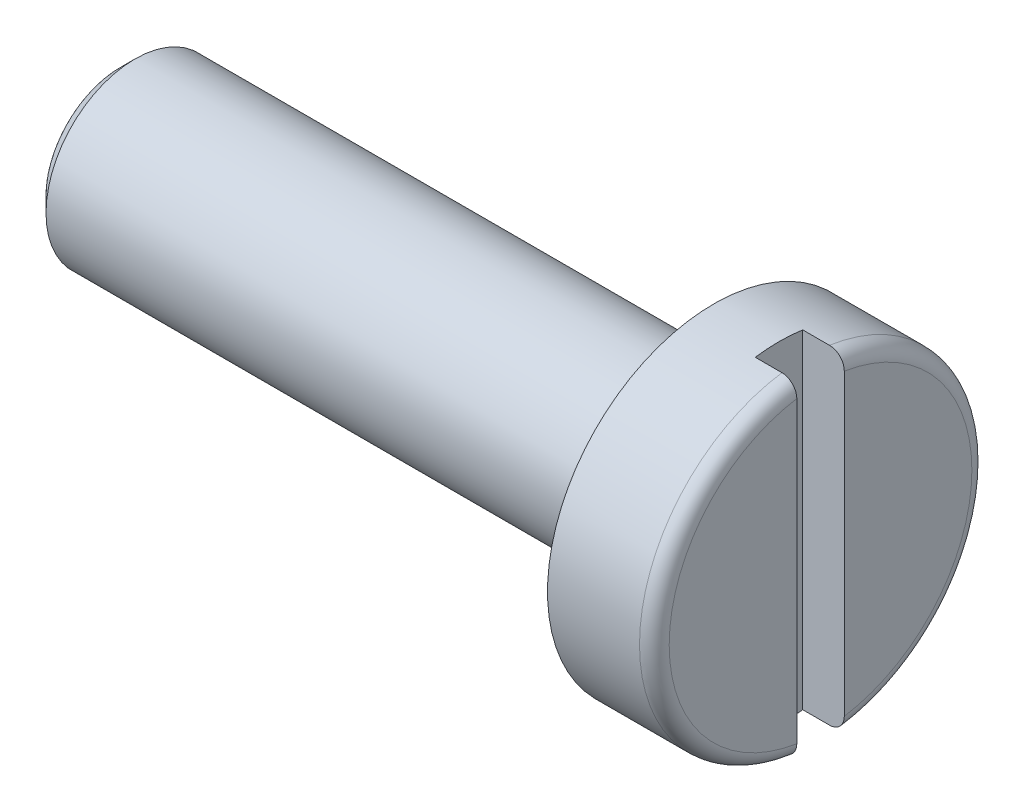
ISO-10303-21;
HEADER;
FILE_DESCRIPTION(('STEP AP214'),'2;1');
FILE_NAME('part.step','',(''),(''),'','','');
FILE_SCHEMA(('AUTOMOTIVE_DESIGN { 1 0 10303 214 1 1 1 1 }'));
ENDSEC;
DATA;
#1=APPLICATION_CONTEXT('core data for automotive mechanical design processes');
#2=APPLICATION_PROTOCOL_DEFINITION('international standard','automotive_design',2000,#1);
#3=PRODUCT_CONTEXT('',#1,'mechanical');
#4=PRODUCT('Part','Part','',(#3));
#5=PRODUCT_RELATED_PRODUCT_CATEGORY('part','',(#4));
#6=PRODUCT_DEFINITION_FORMATION('','',#4);
#7=PRODUCT_DEFINITION_CONTEXT('part definition',#1,'design');
#8=PRODUCT_DEFINITION('design','',#6,#7);
#9=PRODUCT_DEFINITION_SHAPE('','',#8);
#10=(LENGTH_UNIT() NAMED_UNIT(*) SI_UNIT(.MILLI.,.METRE.));
#11=(NAMED_UNIT(*) PLANE_ANGLE_UNIT() SI_UNIT($,.RADIAN.));
#12=(NAMED_UNIT(*) SI_UNIT($,.STERADIAN.) SOLID_ANGLE_UNIT());
#13=UNCERTAINTY_MEASURE_WITH_UNIT(LENGTH_MEASURE(1.E-05),#10,'distance_accuracy_value','');
#14=(GEOMETRIC_REPRESENTATION_CONTEXT(3) GLOBAL_UNCERTAINTY_ASSIGNED_CONTEXT((#13)) GLOBAL_UNIT_ASSIGNED_CONTEXT((#10,
#11,#12)) REPRESENTATION_CONTEXT('',''));
#15=CARTESIAN_POINT('',(0.,0.,0.));
#16=DIRECTION('',(0.,0.,1.));
#17=DIRECTION('',(1.,0.,0.));
#18=AXIS2_PLACEMENT_3D('',#15,#16,#17);
#19=CARTESIAN_POINT('',(0.,0.,0.));
#20=DIRECTION('',(-1.,0.,0.));
#21=DIRECTION('',(0.,0.,1.));
#22=AXIS2_PLACEMENT_3D('',#19,#20,#21);
#23=CYLINDRICAL_SURFACE('',#22,1.25);
#24=CARTESIAN_POINT('',(10.,0.,0.));
#25=DIRECTION('',(-1.,0.,0.));
#26=DIRECTION('',(0.,0.,-1.));
#27=AXIS2_PLACEMENT_3D('',#24,#25,#26);
#28=CIRCLE('',#27,1.25);
#29=CARTESIAN_POINT('',(10.,0.,-1.25));
#30=VERTEX_POINT('',#29);
#31=EDGE_CURVE('P0_E11',#30,#30,#28,.T.);
#32=ORIENTED_EDGE('',*,*,#31,.T.);
#33=CARTESIAN_POINT('',(0.,0.,-1.25));
#34=DIRECTION('',(1.,0.,0.));
#35=VECTOR('',#34,1.);
#36=LINE('',#33,#35);
#37=CARTESIAN_POINT('',(0.,0.,-1.25));
#38=VERTEX_POINT('',#37);
#39=EDGE_CURVE('P0_E27',#38,#30,#36,.T.);
#40=ORIENTED_EDGE('',*,*,#39,.F.);
#41=CARTESIAN_POINT('',(0.,0.,0.));
#42=DIRECTION('',(1.,0.,0.));
#43=DIRECTION('',(0.,0.,-1.));
#44=AXIS2_PLACEMENT_3D('',#41,#42,#43);
#45=CIRCLE('',#44,1.25);
#46=EDGE_CURVE('P0_E46',#38,#38,#45,.T.);
#47=ORIENTED_EDGE('',*,*,#46,.T.);
#48=ORIENTED_EDGE('',*,*,#39,.T.);
#49=EDGE_LOOP('',(#32,#40,#47,#48));
#50=FACE_BOUND('',#49,.T.);
#51=ADVANCED_FACE('P0_F16',(#50),#23,.T.);
#52=CARTESIAN_POINT('',(10.,0.,0.));
#53=DIRECTION('',(-1.,0.,0.));
#54=DIRECTION('',(0.,0.,1.));
#55=AXIS2_PLACEMENT_3D('',#52,#53,#54);
#56=PLANE('',#55);
#57=ORIENTED_EDGE('',*,*,#31,.F.);
#58=EDGE_LOOP('',(#57));
#59=FACE_BOUND('',#58,.T.);
#60=CARTESIAN_POINT('',(10.,1.5,0.));
#61=CARTESIAN_POINT('',(10.,1.49944485432438,-0.298978714802475));
#62=CARTESIAN_POINT('',(10.,1.38581929876717,-0.574025148547617));
#63=CARTESIAN_POINT('',(10.,1.27237987657008,-0.84862102065059));
#64=CARTESIAN_POINT('',(10.,1.06066017177977,-1.06066017177958));
#65=CARTESIAN_POINT('',(10.,0.850620237644176,-1.27101701778694));
#66=CARTESIAN_POINT('',(10.,0.57402514854765,-1.385819298767));
#67=CARTESIAN_POINT('',(10.,0.299442945331056,-1.49978612062476));
#68=CARTESIAN_POINT('',(10.,0.,-1.5));
#69=CARTESIAN_POINT('',(10.,-0.297300186292888,-1.50021234889348));
#70=CARTESIAN_POINT('',(10.,-0.57402514854765,-1.385819298767));
#71=CARTESIAN_POINT('',(10.,-0.848803696688771,-1.27223086071979));
#72=CARTESIAN_POINT('',(10.,-1.06066017177977,-1.06066017177958));
#73=CARTESIAN_POINT('',(10.,-1.27116503976577,-0.850439266678915));
#74=CARTESIAN_POINT('',(10.,-1.38581929876717,-0.574025148547617));
#75=CARTESIAN_POINT('',(10.,-1.49944277959124,-0.300096081066499));
#76=CARTESIAN_POINT('',(10.,-1.5,0.));
#77=B_SPLINE_CURVE_WITH_KNOTS('',2,(#60,#61,#62,#63,#64,#65,#66,#67,#68,#69,#70,#71,#72,#73,#74,
#75,#76),.UNSPECIFIED.,.F.,.F.,(3,2,2,2,2,2,2,2,3),(0.,0.125,0.25,0.375,0.5,0.625,0.75,0.875,
1.),.UNSPECIFIED.);
#78=CARTESIAN_POINT('',(10.,1.5,0.));
#79=VERTEX_POINT('',#78);
#80=CARTESIAN_POINT('',(10.,-1.5,0.));
#81=VERTEX_POINT('',#80);
#82=EDGE_CURVE('P0_E39',#79,#81,#77,.T.);
#83=ORIENTED_EDGE('',*,*,#82,.T.);
#84=CARTESIAN_POINT('',(10.,-1.5,0.));
#85=CARTESIAN_POINT('',(10.,-1.49944485432438,0.298978714802475));
#86=CARTESIAN_POINT('',(10.,-1.38581929876717,0.574025148547617));
#87=CARTESIAN_POINT('',(10.,-1.27237987657008,0.84862102065059));
#88=CARTESIAN_POINT('',(10.,-1.06066017177977,1.06066017177958));
#89=CARTESIAN_POINT('',(10.,-0.850620237644176,1.27101701778694));
#90=CARTESIAN_POINT('',(10.,-0.57402514854765,1.385819298767));
#91=CARTESIAN_POINT('',(10.,-0.299442945331056,1.49978612062476));
#92=CARTESIAN_POINT('',(10.,0.,1.5));
#93=CARTESIAN_POINT('',(10.,0.297300186292888,1.50021234889348));
#94=CARTESIAN_POINT('',(10.,0.57402514854765,1.385819298767));
#95=CARTESIAN_POINT('',(10.,0.848803696688771,1.27223086071979));
#96=CARTESIAN_POINT('',(10.,1.06066017177977,1.06066017177958));
#97=CARTESIAN_POINT('',(10.,1.27116503976577,0.850439266678915));
#98=CARTESIAN_POINT('',(10.,1.38581929876717,0.574025148547617));
#99=CARTESIAN_POINT('',(10.,1.49944277959124,0.300096081066499));
#100=CARTESIAN_POINT('',(10.,1.5,0.));
#101=B_SPLINE_CURVE_WITH_KNOTS('',2,(#84,#85,#86,#87,#88,#89,#90,#91,#92,#93,#94,#95,#96,#97,
#98,#99,#100),.UNSPECIFIED.,.F.,.F.,(3,2,2,2,2,2,2,2,3),(0.,0.125,0.25,0.375,0.5,0.625,0.75,
0.875,1.),.UNSPECIFIED.);
#102=EDGE_CURVE('P0_E43',#81,#79,#101,.T.);
#103=ORIENTED_EDGE('',*,*,#102,.T.);
#104=EDGE_LOOP('',(#83,#103));
#105=FACE_BOUND('',#104,.T.);
#106=ADVANCED_FACE('P0_F17',(#59,#105),#56,.T.);
#107=OPEN_SHELL('',(#51,#106));
#108=SHELL_BASED_SURFACE_MODEL('P0_B1',(#107));
#109=CARTESIAN_POINT('',(11.1,0.,0.));
#110=DIRECTION('',(1.,0.,0.));
#111=DIRECTION('',(0.,1.,0.));
#112=AXIS2_PLACEMENT_3D('',#109,#110,#111);
#113=PLANE('',#112);
#114=DIRECTION('',(0.,1.,0.));
#115=VECTOR('',#114,1.);
#116=CARTESIAN_POINT('',(11.1,-2.77128129211,-0.4));
#117=LINE('',#116,#115);
#118=CARTESIAN_POINT('',(11.1,-2.7712812921101,-0.4));
#119=VERTEX_POINT('',#118);
#120=CARTESIAN_POINT('',(11.1,2.7712812921101,-0.4));
#121=VERTEX_POINT('',#120);
#122=EDGE_CURVE('P1_E11',#119,#121,#117,.T.);
#123=ORIENTED_EDGE('',*,*,#122,.T.);
#124=CARTESIAN_POINT('',(11.1,0.,0.));
#125=DIRECTION('',(1.,0.,0.));
#126=DIRECTION('',(0.,0.,1.));
#127=AXIS2_PLACEMENT_3D('',#124,#125,#126);
#128=CIRCLE('',#127,2.8);
#129=CARTESIAN_POINT('',(11.1,2.7712812921101,0.4));
#130=VERTEX_POINT('',#129);
#131=EDGE_CURVE('P1_E140',#121,#130,#128,.T.);
#132=ORIENTED_EDGE('',*,*,#131,.T.);
#133=DIRECTION('',(0.,-1.,0.));
#134=VECTOR('',#133,1.);
#135=CARTESIAN_POINT('',(11.1,2.77128129211,0.4));
#136=LINE('',#135,#134);
#137=CARTESIAN_POINT('',(11.1,-2.7712812921101,0.4));
#138=VERTEX_POINT('',#137);
#139=EDGE_CURVE('P1_E28',#130,#138,#136,.T.);
#140=ORIENTED_EDGE('',*,*,#139,.T.);
#141=CARTESIAN_POINT('',(11.1,0.,0.));
#142=DIRECTION('',(1.,0.,0.));
#143=DIRECTION('',(0.,0.,1.));
#144=AXIS2_PLACEMENT_3D('',#141,#142,#143);
#145=CIRCLE('',#144,2.8);
#146=EDGE_CURVE('P1_E241',#138,#119,#145,.T.);
#147=ORIENTED_EDGE('',*,*,#146,.T.);
#148=EDGE_LOOP('',(#123,#132,#140,#147));
#149=FACE_BOUND('',#148,.T.);
#150=ADVANCED_FACE('P1_F17',(#149),#113,.T.);
#151=CARTESIAN_POINT('',(11.8,-2.77128129211,-0.4));
#152=DIRECTION('',(0.,0.,-1.));
#153=DIRECTION('',(0.,-1.,0.));
#154=AXIS2_PLACEMENT_3D('',#151,#152,#153);
#155=PLANE('',#154);
#156=DIRECTION('',(1.,0.,0.));
#157=VECTOR('',#156,1.);
#158=CARTESIAN_POINT('',(11.8,2.77128129211,-0.4));
#159=LINE('',#158,#157);
#160=CARTESIAN_POINT('',(11.55,2.7712812921101,-0.4));
#161=VERTEX_POINT('',#160);
#162=EDGE_CURVE('P1_E118',#121,#161,#159,.T.);
#163=ORIENTED_EDGE('',*,*,#162,.F.);
#164=ORIENTED_EDGE('',*,*,#122,.F.);
#165=DIRECTION('',(-1.,0.,0.));
#166=VECTOR('',#165,1.);
#167=CARTESIAN_POINT('',(11.8,-2.77128129211,-0.4));
#168=LINE('',#167,#166);
#169=CARTESIAN_POINT('',(11.55,-2.7712812921101,-0.4));
#170=VERTEX_POINT('',#169);
#171=EDGE_CURVE('P1_E246',#170,#119,#168,.T.);
#172=ORIENTED_EDGE('',*,*,#171,.F.);
#173=CARTESIAN_POINT('',(11.8,-2.5184320518926,-0.399999999999998));
#174=CARTESIAN_POINT('',(11.8000001499877,-2.5232080775273,-0.400000014731042));
#175=CARTESIAN_POINT('',(11.7998665098922,-2.52798410083825,-0.400004206421079));
#176=CARTESIAN_POINT('',(11.799334800731,-2.53747824668973,-0.400019330263479));
#177=CARTESIAN_POINT('',(11.7989391233348,-2.54219650337576,-0.400030201387024));
#178=CARTESIAN_POINT('',(11.7978912282785,-2.55156101291935,-0.400057004385253));
#179=CARTESIAN_POINT('',(11.797241374627,-2.55620753046435,-0.400072889372141));
#180=CARTESIAN_POINT('',(11.7956939110731,-2.56541528445539,-0.400108227012994));
#181=CARTESIAN_POINT('',(11.7947986283706,-2.56997691220869,-0.400127645606346));
#182=CARTESIAN_POINT('',(11.7927696292916,-2.57900245505367,-0.400168711854596));
#183=CARTESIAN_POINT('',(11.791638197094,-2.58346688379076,-0.400190337208213));
#184=CARTESIAN_POINT('',(11.7891467629712,-2.59228645634261,-0.400234635407219));
#185=CARTESIAN_POINT('',(11.7877889957124,-2.59664223153786,-0.400257296576001));
#186=CARTESIAN_POINT('',(11.784855206421,-2.60523379267146,-0.40030263461416));
#187=CARTESIAN_POINT('',(11.7832813636451,-2.60947032282977,-0.400325309319659));
#188=CARTESIAN_POINT('',(11.779926125798,-2.61781356114248,-0.400369787213066));
#189=CARTESIAN_POINT('',(11.7781468490505,-2.62192112120005,-0.400391596642412));
#190=CARTESIAN_POINT('',(11.7743917652759,-2.62999745722752,-0.400433595141505));
#191=CARTESIAN_POINT('',(11.7724180105598,-2.63396718739823,-0.400453797765299));
#192=CARTESIAN_POINT('',(11.7682852485051,-2.64175976701003,-0.40049196589128));
#193=CARTESIAN_POINT('',(11.7661282228171,-2.64558366736636,-0.40050995118434));
#194=CARTESIAN_POINT('',(11.7616403903044,-2.6530773469488,-0.40054319341785));
#195=CARTESIAN_POINT('',(11.7593114902621,-2.6567482680552,-0.400558475331081));
#196=CARTESIAN_POINT('',(11.7544915153807,-2.66392959211244,-0.400585938420153));
#197=CARTESIAN_POINT('',(11.7520022686877,-2.66744122202426,-0.400598148719712));
#198=CARTESIAN_POINT('',(11.74687328555,-2.6742983938252,-0.400619208262128));
#199=CARTESIAN_POINT('',(11.7442352952863,-2.67764524176744,-0.40062808977553));
#200=CARTESIAN_POINT('',(11.7388205355894,-2.68416808766379,-0.400642336669544));
#201=CARTESIAN_POINT('',(11.7360454274795,-2.68734546470068,-0.400647736492828));
#202=CARTESIAN_POINT('',(11.7303681181015,-2.69352539273437,-0.400654963354951));
#203=CARTESIAN_POINT('',(11.727467490837,-2.69652938973654,-0.400656826065548));
#204=CARTESIAN_POINT('',(11.7215507576069,-2.70235934314376,-0.400657013701611));
#205=CARTESIAN_POINT('',(11.7185361362872,-2.70518680635359,-0.400655374618471));
#206=CARTESIAN_POINT('',(11.7124029140323,-2.710661212559,-0.400648678626466));
#207=CARTESIAN_POINT('',(11.7092857067623,-2.71330971704691,-0.400643657154391));
#208=CARTESIAN_POINT('',(11.7029586556877,-2.71842443272481,-0.400630394728944));
#209=CARTESIAN_POINT('',(11.6997501133486,-2.72089225402035,-0.40062218782005));
#210=CARTESIAN_POINT('',(11.6932515417626,-2.72564450678061,-0.400602824820343));
#211=CARTESIAN_POINT('',(11.6899627209548,-2.72793059095216,-0.400591700581557));
#212=CARTESIAN_POINT('',(11.6833145143184,-2.73231891818737,-0.400566838916753));
#213=CARTESIAN_POINT('',(11.6799562434539,-2.734422850633,-0.40055313038849));
#214=CARTESIAN_POINT('',(11.6731797996928,-2.73844703604027,-0.400523495767292));
#215=CARTESIAN_POINT('',(11.6697626482001,-2.74036900924053,-0.400507594894826));
#216=CARTESIAN_POINT('',(11.6628788191908,-2.74403001750719,-0.400474024978898));
#217=CARTESIAN_POINT('',(11.6594130697796,-2.74577079797827,-0.400456376794645));
#218=CARTESIAN_POINT('',(11.6524421088884,-2.749070708094,-0.400419809788738));
#219=CARTESIAN_POINT('',(11.648937732807,-2.75063160276528,-0.400400906820105));
#220=CARTESIAN_POINT('',(11.6418992483377,-2.75357354040086,-0.40036237052659));
#221=CARTESIAN_POINT('',(11.6383658835453,-2.75495636263296,-0.400342747442436));
#222=CARTESIAN_POINT('',(11.6312787979267,-2.75754443198294,-0.40030334879851));
#223=CARTESIAN_POINT('',(11.6277257300895,-2.75875146740747,-0.400283577299506));
#224=CARTESIAN_POINT('',(11.6206082446186,-2.76099068292486,-0.400244492423543));
#225=CARTESIAN_POINT('',(11.6170443908381,-2.76202465535217,-0.400225176397453));
#226=CARTESIAN_POINT('',(11.6099139557561,-2.76392087356048,-0.400187641116465));
#227=CARTESIAN_POINT('',(11.606347850897,-2.76478491089757,-0.400169412010035));
#228=CARTESIAN_POINT('',(11.5992211406517,-2.76634476322792,-0.400134713017984));
#229=CARTESIAN_POINT('',(11.5956609262562,-2.76704236439996,-0.400118225620761));
#230=CARTESIAN_POINT('',(11.5885538194447,-2.76827318907399,-0.400087691744528));
#231=CARTESIAN_POINT('',(11.5850072347441,-2.76880818902139,-0.40007361967634));
#232=CARTESIAN_POINT('',(11.5779347995078,-2.76971797061208,-0.400048615176956));
#233=CARTESIAN_POINT('',(11.5744091757738,-2.77009451475907,-0.400037648677141));
#234=CARTESIAN_POINT('',(11.5673856566793,-2.77069180100568,-0.400019561505633));
#235=CARTESIAN_POINT('',(11.5638879097796,-2.77091428798684,-0.400012397985044));
#236=CARTESIAN_POINT('',(11.5569267295714,-2.77120819658656,-0.400002648943097));
#237=CARTESIAN_POINT('',(11.5534633689794,-2.77128134092906,-0.400000011271691));
#238=CARTESIAN_POINT('',(11.55,-2.7712812921102,-0.399999999999997));
#239=B_SPLINE_CURVE_WITH_KNOTS('',3,(#173,#174,#175,#176,#177,#178,#179,#180,#181,#182,#183,
#184,#185,#186,#187,#188,#189,#190,#191,#192,#193,#194,#195,#196,#197,#198,#199,#200,#201,#202,
#203,#204,#205,#206,#207,#208,#209,#210,#211,#212,#213,#214,#215,#216,#217,#218,#219,#220,#221,
#222,#223,#224,#225,#226,#227,#228,#229,#230,#231,#232,#233,#234,#235,#236,#237,#238),
.UNSPECIFIED.,.F.,.F.,(4,2,2,2,2,2,2,2,2,2,2,2,2,2,2,2,2,2,2,2,2,2,2,2,2,2,2,2,2,2,2,2,4),(0.,
0.0143261945096147,0.0285234004453319,0.0425915880474614,0.0565307362643893,0.0703408344989951,
0.0840218842562883,0.097573900686072,0.110996914015537,0.124290970867783,0.137456135463422,
0.150492490703561,0.163400139133604,0.17617920378845,0.188829828920755,0.201352180614966,
0.213746447290823,0.226012840100953,0.238151593228016,0.250162964087615,0.262047233443892,
0.273804705445259,0.285435707588242,0.296940590617828,0.308319728372957,0.319573517586092,
0.330702377645872,0.341706750331957,0.352587099531127,0.36334391094361,0.37397769178848,
0.384488970516739,0.394878296540456),.UNSPECIFIED.);
#240=CARTESIAN_POINT('',(11.8,-2.518432051893,-0.4));
#241=VERTEX_POINT('',#240);
#242=EDGE_CURVE('P1_E93',#241,#170,#239,.T.);
#243=ORIENTED_EDGE('',*,*,#242,.F.);
#244=DIRECTION('',(0.,1.,0.));
#245=VECTOR('',#244,1.);
#246=CARTESIAN_POINT('',(11.8,0.,-0.4));
#247=LINE('',#246,#245);
#248=CARTESIAN_POINT('',(11.8,2.518432051893,-0.4));
#249=VERTEX_POINT('',#248);
#250=EDGE_CURVE('P1_E41',#241,#249,#247,.T.);
#251=ORIENTED_EDGE('',*,*,#250,.T.);
#252=CARTESIAN_POINT('',(11.55,2.7712812921102,-0.400000000000007));
#253=CARTESIAN_POINT('',(11.5534633689794,2.77128134092906,-0.400000011271698));
#254=CARTESIAN_POINT('',(11.5569267295714,2.77120819658656,-0.400002648943104));
#255=CARTESIAN_POINT('',(11.5638879097796,2.77091428798684,-0.400012397985052));
#256=CARTESIAN_POINT('',(11.5673856566793,2.77069180100567,-0.400019561505642));
#257=CARTESIAN_POINT('',(11.5744091757738,2.77009451475907,-0.40003764867715));
#258=CARTESIAN_POINT('',(11.5779347995078,2.76971797061207,-0.400048615176964));
#259=CARTESIAN_POINT('',(11.5850072347441,2.76880818902139,-0.400073619676348));
#260=CARTESIAN_POINT('',(11.5885538194447,2.76827318907399,-0.400087691744539));
#261=CARTESIAN_POINT('',(11.5956609262562,2.76704236439996,-0.400118225620772));
#262=CARTESIAN_POINT('',(11.5992211406517,2.76634476322792,-0.400134713017994));
#263=CARTESIAN_POINT('',(11.606347850897,2.76478491089757,-0.400169412010044));
#264=CARTESIAN_POINT('',(11.6099139557561,2.76392087356048,-0.400187641116474));
#265=CARTESIAN_POINT('',(11.6170443908381,2.76202465535216,-0.400225176397463));
#266=CARTESIAN_POINT('',(11.6206082446186,2.76099068292485,-0.400244492423551));
#267=CARTESIAN_POINT('',(11.6277257300895,2.75875146740747,-0.400283577299515));
#268=CARTESIAN_POINT('',(11.6312787979267,2.75754443198294,-0.400303348798519));
#269=CARTESIAN_POINT('',(11.6383658835453,2.75495636263295,-0.400342747442445));
#270=CARTESIAN_POINT('',(11.6418992483377,2.75357354040086,-0.400362370526598));
#271=CARTESIAN_POINT('',(11.648937732807,2.75063160276528,-0.400400906820111));
#272=CARTESIAN_POINT('',(11.6524421088884,2.74907070809399,-0.400419809788744));
#273=CARTESIAN_POINT('',(11.6594130697796,2.74577079797827,-0.400456376794652));
#274=CARTESIAN_POINT('',(11.6628788191908,2.74403001750718,-0.400474024978906));
#275=CARTESIAN_POINT('',(11.6697626482001,2.74036900924052,-0.400507594894833));
#276=CARTESIAN_POINT('',(11.6731797996928,2.73844703604027,-0.400523495767297));
#277=CARTESIAN_POINT('',(11.6799562434539,2.734422850633,-0.400553130388495));
#278=CARTESIAN_POINT('',(11.6833145143184,2.73231891818737,-0.40056683891676));
#279=CARTESIAN_POINT('',(11.6899627209548,2.72793059095216,-0.400591700581565));
#280=CARTESIAN_POINT('',(11.6932515417626,2.7256445067806,-0.400602824820349));
#281=CARTESIAN_POINT('',(11.6997501133486,2.72089225402035,-0.400622187820055));
#282=CARTESIAN_POINT('',(11.7029586556877,2.7184244327248,-0.400630394728949));
#283=CARTESIAN_POINT('',(11.7092857067623,2.71330971704691,-0.400643657154397));
#284=CARTESIAN_POINT('',(11.7124029140324,2.710661212559,-0.400648678626472));
#285=CARTESIAN_POINT('',(11.7185361362872,2.70518680635359,-0.400655374618477));
#286=CARTESIAN_POINT('',(11.7215507576069,2.70235934314376,-0.400657013701617));
#287=CARTESIAN_POINT('',(11.727467490837,2.69652938973653,-0.400656826065554));
#288=CARTESIAN_POINT('',(11.7303681181015,2.69352539273436,-0.400654963354956));
#289=CARTESIAN_POINT('',(11.7360454274795,2.68734546470067,-0.400647736492833));
#290=CARTESIAN_POINT('',(11.7388205355894,2.68416808766378,-0.400642336669549));
#291=CARTESIAN_POINT('',(11.7442352952863,2.67764524176744,-0.400628089775533));
#292=CARTESIAN_POINT('',(11.74687328555,2.67429839382519,-0.400619208262131));
#293=CARTESIAN_POINT('',(11.7520022686877,2.66744122202426,-0.400598148719713));
#294=CARTESIAN_POINT('',(11.7544915153807,2.66392959211244,-0.400585938420154));
#295=CARTESIAN_POINT('',(11.7593114902621,2.65674826805519,-0.400558475331082));
#296=CARTESIAN_POINT('',(11.7616403903044,2.6530773469488,-0.400543193417851));
#297=CARTESIAN_POINT('',(11.7661282228171,2.64558366736636,-0.40050995118434));
#298=CARTESIAN_POINT('',(11.7682852485051,2.64175976701002,-0.40049196589128));
#299=CARTESIAN_POINT('',(11.7724180105598,2.63396718739823,-0.400453797765298));
#300=CARTESIAN_POINT('',(11.7743917652759,2.62999745722751,-0.400433595141503));
#301=CARTESIAN_POINT('',(11.7781468490505,2.62192112120004,-0.400391596642411));
#302=CARTESIAN_POINT('',(11.779926125798,2.61781356114247,-0.400369787213067));
#303=CARTESIAN_POINT('',(11.7832813636451,2.60947032282977,-0.400325309319659));
#304=CARTESIAN_POINT('',(11.784855206421,2.60523379267146,-0.400302634614159));
#305=CARTESIAN_POINT('',(11.7877889957124,2.59664223153786,-0.400257296575998));
#306=CARTESIAN_POINT('',(11.7891467629712,2.59228645634261,-0.400234635407217));
#307=CARTESIAN_POINT('',(11.791638197094,2.58346688379076,-0.400190337208209));
#308=CARTESIAN_POINT('',(11.7927696292916,2.57900245505367,-0.400168711854589));
#309=CARTESIAN_POINT('',(11.7947986283706,2.56997691220869,-0.40012764560634));
#310=CARTESIAN_POINT('',(11.7956939110731,2.56541528445539,-0.400108227012991));
#311=CARTESIAN_POINT('',(11.797241374627,2.55620753046435,-0.400072889372138));
#312=CARTESIAN_POINT('',(11.7978912282785,2.55156101291935,-0.400057004385247));
#313=CARTESIAN_POINT('',(11.7989391233348,2.54219650337576,-0.400030201387018));
#314=CARTESIAN_POINT('',(11.799334800731,2.53747824668973,-0.400019330263475));
#315=CARTESIAN_POINT('',(11.7998665098922,2.52798410083825,-0.400004206421077));
#316=CARTESIAN_POINT('',(11.8000001499877,2.5232080775273,-0.400000014731041));
#317=CARTESIAN_POINT('',(11.8,2.5184320518926,-0.399999999999992));
#318=B_SPLINE_CURVE_WITH_KNOTS('',3,(#252,#253,#254,#255,#256,#257,#258,#259,#260,#261,#262,
#263,#264,#265,#266,#267,#268,#269,#270,#271,#272,#273,#274,#275,#276,#277,#278,#279,#280,#281,
#282,#283,#284,#285,#286,#287,#288,#289,#290,#291,#292,#293,#294,#295,#296,#297,#298,#299,#300,
#301,#302,#303,#304,#305,#306,#307,#308,#309,#310,#311,#312,#313,#314,#315,#316,#317),
.UNSPECIFIED.,.F.,.F.,(4,2,2,2,2,2,2,2,2,2,2,2,2,2,2,2,2,2,2,2,2,2,2,2,2,2,2,2,2,2,2,2,4),(0.,
0.0103893260237183,0.0209006047519773,0.031534385596847,0.0422911970093303,0.0531715462085023,
0.0641759188945876,0.0753047789543691,0.0865585681675039,0.0979377059226329,0.109442588952219,
0.121073591095202,0.132831063096569,0.144715332452847,0.156726703312446,0.168865456439507,
0.181131849249637,0.193526115925495,0.206048467619706,0.218699092752012,0.231478157406856,
0.244385805836899,0.257422161077037,0.270587325672677,0.283881382524922,0.297304395854386,
0.31085641228417,0.324537462041462,0.338347560276067,0.352286708492994,0.366354896095123,
0.380552102030839,0.394878296540453),.UNSPECIFIED.);
#319=EDGE_CURVE('P1_E113',#161,#249,#318,.T.);
#320=ORIENTED_EDGE('',*,*,#319,.F.);
#321=EDGE_LOOP('',(#163,#164,#172,#243,#251,#320));
#322=FACE_BOUND('',#321,.T.);
#323=ADVANCED_FACE('P1_F116',(#322),#155,.F.);
#324=CARTESIAN_POINT('',(11.8,2.77128129211,0.4));
#325=DIRECTION('',(0.,0.,1.));
#326=DIRECTION('',(1.,0.,0.));
#327=AXIS2_PLACEMENT_3D('',#324,#325,#326);
#328=PLANE('',#327);
#329=DIRECTION('',(1.,0.,0.));
#330=VECTOR('',#329,1.);
#331=CARTESIAN_POINT('',(11.8,-2.77128129211,0.4));
#332=LINE('',#331,#330);
#333=CARTESIAN_POINT('',(11.55,-2.7712812921101,0.4));
#334=VERTEX_POINT('',#333);
#335=EDGE_CURVE('P1_E198',#138,#334,#332,.T.);
#336=ORIENTED_EDGE('',*,*,#335,.F.);
#337=ORIENTED_EDGE('',*,*,#139,.F.);
#338=DIRECTION('',(-1.,0.,0.));
#339=VECTOR('',#338,1.);
#340=CARTESIAN_POINT('',(11.8,2.77128129211,0.4));
#341=LINE('',#340,#339);
#342=CARTESIAN_POINT('',(11.55,2.7712812921101,0.4));
#343=VERTEX_POINT('',#342);
#344=EDGE_CURVE('P1_E147',#343,#130,#341,.T.);
#345=ORIENTED_EDGE('',*,*,#344,.F.);
#346=CARTESIAN_POINT('',(11.8,2.5184320518926,0.399999999999999));
#347=CARTESIAN_POINT('',(11.8000001499877,2.5232080775273,0.400000014731043));
#348=CARTESIAN_POINT('',(11.7998665098922,2.52798410083825,0.400004206421079));
#349=CARTESIAN_POINT('',(11.799334800731,2.53747824668973,0.40001933026348));
#350=CARTESIAN_POINT('',(11.7989391233348,2.54219650337576,0.400030201387025));
#351=CARTESIAN_POINT('',(11.7978912282785,2.55156101291935,0.400057004385254));
#352=CARTESIAN_POINT('',(11.797241374627,2.55620753046435,0.400072889372141));
#353=CARTESIAN_POINT('',(11.7956939110731,2.56541528445539,0.400108227012994));
#354=CARTESIAN_POINT('',(11.7947986283706,2.56997691220869,0.400127645606346));
#355=CARTESIAN_POINT('',(11.7927696292916,2.57900245505367,0.400168711854596));
#356=CARTESIAN_POINT('',(11.791638197094,2.58346688379076,0.400190337208213));
#357=CARTESIAN_POINT('',(11.7891467629712,2.59228645634261,0.400234635407219));
#358=CARTESIAN_POINT('',(11.7877889957124,2.59664223153786,0.400257296576001));
#359=CARTESIAN_POINT('',(11.784855206421,2.60523379267146,0.400302634614161));
#360=CARTESIAN_POINT('',(11.7832813636451,2.60947032282977,0.400325309319659));
#361=CARTESIAN_POINT('',(11.779926125798,2.61781356114248,0.400369787213066));
#362=CARTESIAN_POINT('',(11.7781468490505,2.62192112120005,0.400391596642412));
#363=CARTESIAN_POINT('',(11.7743917652759,2.62999745722751,0.400433595141505));
#364=CARTESIAN_POINT('',(11.7724180105598,2.63396718739823,0.400453797765299));
#365=CARTESIAN_POINT('',(11.7682852485051,2.64175976701003,0.40049196589128));
#366=CARTESIAN_POINT('',(11.766128222817,2.64558366736636,0.40050995118434));
#367=CARTESIAN_POINT('',(11.7616403903044,2.6530773469488,0.40054319341785));
#368=CARTESIAN_POINT('',(11.759311490262,2.65674826805519,0.400558475331081));
#369=CARTESIAN_POINT('',(11.7544915153807,2.66392959211244,0.400585938420153));
#370=CARTESIAN_POINT('',(11.7520022686877,2.66744122202426,0.400598148719712));
#371=CARTESIAN_POINT('',(11.74687328555,2.67429839382519,0.400619208262129));
#372=CARTESIAN_POINT('',(11.7442352952863,2.67764524176744,0.40062808977553));
#373=CARTESIAN_POINT('',(11.7388205355894,2.68416808766378,0.400642336669544));
#374=CARTESIAN_POINT('',(11.7360454274795,2.68734546470067,0.400647736492828));
#375=CARTESIAN_POINT('',(11.7303681181015,2.69352539273436,0.400654963354951));
#376=CARTESIAN_POINT('',(11.727467490837,2.69652938973653,0.400656826065548));
#377=CARTESIAN_POINT('',(11.7215507576069,2.70235934314376,0.400657013701611));
#378=CARTESIAN_POINT('',(11.7185361362872,2.70518680635359,0.400655374618471));
#379=CARTESIAN_POINT('',(11.7124029140323,2.710661212559,0.400648678626466));
#380=CARTESIAN_POINT('',(11.7092857067623,2.71330971704691,0.400643657154391));
#381=CARTESIAN_POINT('',(11.7029586556877,2.71842443272481,0.400630394728943));
#382=CARTESIAN_POINT('',(11.6997501133486,2.72089225402035,0.40062218782005));
#383=CARTESIAN_POINT('',(11.6932515417626,2.72564450678061,0.400602824820342));
#384=CARTESIAN_POINT('',(11.6899627209548,2.72793059095216,0.400591700581557));
#385=CARTESIAN_POINT('',(11.6833145143184,2.73231891818737,0.400566838916753));
#386=CARTESIAN_POINT('',(11.6799562434539,2.734422850633,0.40055313038849));
#387=CARTESIAN_POINT('',(11.6731797996928,2.73844703604027,0.400523495767292));
#388=CARTESIAN_POINT('',(11.6697626482001,2.74036900924053,0.400507594894826));
#389=CARTESIAN_POINT('',(11.6628788191908,2.74403001750718,0.400474024978898));
#390=CARTESIAN_POINT('',(11.6594130697796,2.74577079797827,0.400456376794645));
#391=CARTESIAN_POINT('',(11.6524421088884,2.74907070809399,0.400419809788737));
#392=CARTESIAN_POINT('',(11.648937732807,2.75063160276528,0.400400906820104));
#393=CARTESIAN_POINT('',(11.6418992483377,2.75357354040086,0.40036237052659));
#394=CARTESIAN_POINT('',(11.6383658835453,2.75495636263296,0.400342747442436));
#395=CARTESIAN_POINT('',(11.6312787979267,2.75754443198294,0.400303348798509));
#396=CARTESIAN_POINT('',(11.6277257300895,2.75875146740747,0.400283577299506));
#397=CARTESIAN_POINT('',(11.6206082446186,2.76099068292486,0.400244492423542));
#398=CARTESIAN_POINT('',(11.6170443908381,2.76202465535217,0.400225176397453));
#399=CARTESIAN_POINT('',(11.6099139557561,2.76392087356048,0.400187641116465));
#400=CARTESIAN_POINT('',(11.606347850897,2.76478491089757,0.400169412010035));
#401=CARTESIAN_POINT('',(11.5992211406517,2.76634476322792,0.400134713017984));
#402=CARTESIAN_POINT('',(11.5956609262562,2.76704236439996,0.400118225620761));
#403=CARTESIAN_POINT('',(11.5885538194447,2.76827318907399,0.400087691744527));
#404=CARTESIAN_POINT('',(11.5850072347441,2.76880818902139,0.40007361967634));
#405=CARTESIAN_POINT('',(11.5779347995078,2.76971797061208,0.400048615176956));
#406=CARTESIAN_POINT('',(11.5744091757738,2.77009451475907,0.400037648677141));
#407=CARTESIAN_POINT('',(11.5673856566793,2.77069180100567,0.400019561505632));
#408=CARTESIAN_POINT('',(11.5638879097796,2.77091428798684,0.400012397985044));
#409=CARTESIAN_POINT('',(11.5569267295714,2.77120819658656,0.400002648943096));
#410=CARTESIAN_POINT('',(11.5534633689794,2.77128134092906,0.400000011271691));
#411=CARTESIAN_POINT('',(11.55,2.7712812921102,0.399999999999997));
#412=B_SPLINE_CURVE_WITH_KNOTS('',3,(#346,#347,#348,#349,#350,#351,#352,#353,#354,#355,#356,
#357,#358,#359,#360,#361,#362,#363,#364,#365,#366,#367,#368,#369,#370,#371,#372,#373,#374,#375,
#376,#377,#378,#379,#380,#381,#382,#383,#384,#385,#386,#387,#388,#389,#390,#391,#392,#393,#394,
#395,#396,#397,#398,#399,#400,#401,#402,#403,#404,#405,#406,#407,#408,#409,#410,#411),
.UNSPECIFIED.,.F.,.F.,(4,2,2,2,2,2,2,2,2,2,2,2,2,2,2,2,2,2,2,2,2,2,2,2,2,2,2,2,2,2,2,2,4),(0.,
0.0143261945096143,0.028523400445331,0.0425915880474601,0.0565307362643881,0.0703408344989934,
0.0840218842562856,0.0975739006860696,0.110996914015534,0.12429097086778,0.137456135463419,
0.150492490703558,0.163400139133601,0.176179203788446,0.188829828920751,0.201352180614962,
0.21374644729082,0.22601284010095,0.238151593228011,0.25016296408761,0.262047233443887,
0.273804705445254,0.285435707588237,0.296940590617823,0.308319728372952,0.319573517586087,
0.330702377645865,0.341706750331952,0.352587099531123,0.363343910943606,0.373977691788476,
0.384488970516733,0.394878296540451),.UNSPECIFIED.);
#413=CARTESIAN_POINT('',(11.8,2.518432051893,0.4));
#414=VERTEX_POINT('',#413);
#415=EDGE_CURVE('P1_E123',#414,#343,#412,.T.);
#416=ORIENTED_EDGE('',*,*,#415,.F.);
#417=DIRECTION('',(0.,-1.,0.));
#418=VECTOR('',#417,1.);
#419=CARTESIAN_POINT('',(11.8,0.,0.4));
#420=LINE('',#419,#418);
#421=CARTESIAN_POINT('',(11.8,-2.518432051893,0.4));
#422=VERTEX_POINT('',#421);
#423=EDGE_CURVE('P1_E214',#414,#422,#420,.T.);
#424=ORIENTED_EDGE('',*,*,#423,.T.);
#425=CARTESIAN_POINT('',(11.55,-2.7712812921102,0.400000000000007));
#426=CARTESIAN_POINT('',(11.5534633689794,-2.77128134092906,0.400000011271699));
#427=CARTESIAN_POINT('',(11.5569267295714,-2.77120819658656,0.400002648943104));
#428=CARTESIAN_POINT('',(11.5638879097796,-2.77091428798684,0.400012397985053));
#429=CARTESIAN_POINT('',(11.5673856566793,-2.77069180100567,0.400019561505643));
#430=CARTESIAN_POINT('',(11.5744091757738,-2.77009451475907,0.40003764867715));
#431=CARTESIAN_POINT('',(11.5779347995078,-2.76971797061207,0.400048615176964));
#432=CARTESIAN_POINT('',(11.5850072347441,-2.76880818902139,0.400073619676349));
#433=CARTESIAN_POINT('',(11.5885538194447,-2.76827318907399,0.400087691744539));
#434=CARTESIAN_POINT('',(11.5956609262562,-2.76704236439996,0.400118225620773));
#435=CARTESIAN_POINT('',(11.5992211406517,-2.76634476322791,0.400134713017994));
#436=CARTESIAN_POINT('',(11.606347850897,-2.76478491089757,0.400169412010044));
#437=CARTESIAN_POINT('',(11.6099139557561,-2.76392087356048,0.400187641116475));
#438=CARTESIAN_POINT('',(11.6170443908381,-2.76202465535216,0.400225176397463));
#439=CARTESIAN_POINT('',(11.6206082446186,-2.76099068292485,0.400244492423552));
#440=CARTESIAN_POINT('',(11.6277257300895,-2.75875146740746,0.400283577299515));
#441=CARTESIAN_POINT('',(11.6312787979267,-2.75754443198294,0.400303348798519));
#442=CARTESIAN_POINT('',(11.6383658835453,-2.75495636263295,0.400342747442446));
#443=CARTESIAN_POINT('',(11.6418992483377,-2.75357354040086,0.400362370526599));
#444=CARTESIAN_POINT('',(11.648937732807,-2.75063160276528,0.400400906820112));
#445=CARTESIAN_POINT('',(11.6524421088884,-2.74907070809399,0.400419809788745));
#446=CARTESIAN_POINT('',(11.6594130697796,-2.74577079797827,0.400456376794653));
#447=CARTESIAN_POINT('',(11.6628788191908,-2.74403001750718,0.400474024978907));
#448=CARTESIAN_POINT('',(11.6697626482001,-2.74036900924052,0.400507594894834));
#449=CARTESIAN_POINT('',(11.6731797996928,-2.73844703604027,0.400523495767298));
#450=CARTESIAN_POINT('',(11.6799562434539,-2.734422850633,0.400553130388496));
#451=CARTESIAN_POINT('',(11.6833145143184,-2.73231891818737,0.400566838916761));
#452=CARTESIAN_POINT('',(11.6899627209548,-2.72793059095216,0.400591700581566));
#453=CARTESIAN_POINT('',(11.6932515417626,-2.7256445067806,0.40060282482035));
#454=CARTESIAN_POINT('',(11.6997501133486,-2.72089225402035,0.400622187820056));
#455=CARTESIAN_POINT('',(11.7029586556877,-2.7184244327248,0.40063039472895));
#456=CARTESIAN_POINT('',(11.7092857067623,-2.71330971704691,0.400643657154398));
#457=CARTESIAN_POINT('',(11.7124029140323,-2.710661212559,0.400648678626473));
#458=CARTESIAN_POINT('',(11.7185361362872,-2.70518680635359,0.400655374618478));
#459=CARTESIAN_POINT('',(11.7215507576069,-2.70235934314376,0.400657013701618));
#460=CARTESIAN_POINT('',(11.727467490837,-2.69652938973653,0.400656826065555));
#461=CARTESIAN_POINT('',(11.7303681181015,-2.69352539273436,0.400654963354957));
#462=CARTESIAN_POINT('',(11.7360454274795,-2.68734546470067,0.400647736492834));
#463=CARTESIAN_POINT('',(11.7388205355894,-2.68416808766378,0.40064233666955));
#464=CARTESIAN_POINT('',(11.7442352952863,-2.67764524176744,0.400628089775535));
#465=CARTESIAN_POINT('',(11.74687328555,-2.67429839382519,0.400619208262132));
#466=CARTESIAN_POINT('',(11.7520022686877,-2.66744122202426,0.400598148719714));
#467=CARTESIAN_POINT('',(11.7544915153807,-2.66392959211244,0.400585938420155));
#468=CARTESIAN_POINT('',(11.7593114902621,-2.65674826805519,0.400558475331083));
#469=CARTESIAN_POINT('',(11.7616403903044,-2.6530773469488,0.400543193417852));
#470=CARTESIAN_POINT('',(11.766128222817,-2.64558366736636,0.400509951184342));
#471=CARTESIAN_POINT('',(11.7682852485051,-2.64175976701002,0.400491965891282));
#472=CARTESIAN_POINT('',(11.7724180105598,-2.63396718739823,0.4004537977653));
#473=CARTESIAN_POINT('',(11.7743917652759,-2.62999745722751,0.400433595141504));
#474=CARTESIAN_POINT('',(11.7781468490505,-2.62192112120004,0.400391596642412));
#475=CARTESIAN_POINT('',(11.779926125798,-2.61781356114247,0.400369787213068));
#476=CARTESIAN_POINT('',(11.7832813636451,-2.60947032282977,0.400325309319661));
#477=CARTESIAN_POINT('',(11.784855206421,-2.60523379267146,0.40030263461416));
#478=CARTESIAN_POINT('',(11.7877889957124,-2.59664223153786,0.400257296575999));
#479=CARTESIAN_POINT('',(11.7891467629712,-2.59228645634261,0.400234635407218));
#480=CARTESIAN_POINT('',(11.791638197094,-2.58346688379076,0.40019033720821));
#481=CARTESIAN_POINT('',(11.7927696292916,-2.57900245505367,0.400168711854591));
#482=CARTESIAN_POINT('',(11.7947986283706,-2.56997691220869,0.400127645606342));
#483=CARTESIAN_POINT('',(11.7956939110731,-2.56541528445539,0.400108227012993));
#484=CARTESIAN_POINT('',(11.797241374627,-2.55620753046435,0.400072889372139));
#485=CARTESIAN_POINT('',(11.7978912282785,-2.55156101291935,0.400057004385248));
#486=CARTESIAN_POINT('',(11.7989391233348,-2.54219650337576,0.400030201387019));
#487=CARTESIAN_POINT('',(11.799334800731,-2.53747824668974,0.400019330263477));
#488=CARTESIAN_POINT('',(11.7998665098922,-2.52798410083825,0.400004206421079));
#489=CARTESIAN_POINT('',(11.8000001499877,-2.5232080775273,0.400000014731043));
#490=CARTESIAN_POINT('',(11.8,-2.5184320518926,0.399999999999994));
#491=B_SPLINE_CURVE_WITH_KNOTS('',3,(#425,#426,#427,#428,#429,#430,#431,#432,#433,#434,#435,
#436,#437,#438,#439,#440,#441,#442,#443,#444,#445,#446,#447,#448,#449,#450,#451,#452,#453,#454,
#455,#456,#457,#458,#459,#460,#461,#462,#463,#464,#465,#466,#467,#468,#469,#470,#471,#472,#473,
#474,#475,#476,#477,#478,#479,#480,#481,#482,#483,#484,#485,#486,#487,#488,#489,#490),
.UNSPECIFIED.,.F.,.F.,(4,2,2,2,2,2,2,2,2,2,2,2,2,2,2,2,2,2,2,2,2,2,2,2,2,2,2,2,2,2,2,2,4),(0.,
0.0103893260237183,0.0209006047519773,0.0315343855968471,0.0422911970093303,0.0531715462085007,
0.0641759188945875,0.0753047789543673,0.0865585681675021,0.0979377059226311,0.109442588952217,
0.121073591095202,0.132831063096568,0.144715332452845,0.156726703312444,0.168865456439505,
0.181131849249635,0.193526115925492,0.206048467619704,0.218699092752008,0.231478157406854,
0.244385805836897,0.257422161077035,0.270587325672674,0.283881382524919,0.297304395854384,
0.310856412284167,0.324537462041459,0.338347560276063,0.352286708492991,0.36635489609512,
0.380552102030836,0.39487829654045),.UNSPECIFIED.);
#492=EDGE_CURVE('P1_E134',#334,#422,#491,.T.);
#493=ORIENTED_EDGE('',*,*,#492,.F.);
#494=EDGE_LOOP('',(#336,#337,#345,#416,#424,#493));
#495=FACE_BOUND('',#494,.T.);
#496=ADVANCED_FACE('P1_F199',(#495),#328,.F.);
#497=CARTESIAN_POINT('',(11.8,0.,0.));
#498=DIRECTION('',(-1.,0.,0.));
#499=DIRECTION('',(0.,0.,1.));
#500=AXIS2_PLACEMENT_3D('',#497,#498,#499);
#501=PLANE('',#500);
#502=ORIENTED_EDGE('',*,*,#250,.F.);
#503=CARTESIAN_POINT('',(11.8,0.,0.));
#504=DIRECTION('',(-1.,0.,0.));
#505=DIRECTION('',(0.,-0.987620412506908,-0.156862745098015));
#506=AXIS2_PLACEMENT_3D('',#503,#504,#505);
#507=CIRCLE('',#506,2.55000000000039);
#508=EDGE_CURVE('P1_E122',#249,#241,#507,.T.);
#509=ORIENTED_EDGE('',*,*,#508,.F.);
#510=EDGE_LOOP('',(#502,#509));
#511=FACE_BOUND('',#510,.T.);
#512=ADVANCED_FACE('P1_F208',(#511),#501,.F.);
#513=CARTESIAN_POINT('',(11.8,0.,0.));
#514=DIRECTION('',(-1.,0.,0.));
#515=DIRECTION('',(0.,0.,1.));
#516=AXIS2_PLACEMENT_3D('',#513,#514,#515);
#517=PLANE('',#516);
#518=ORIENTED_EDGE('',*,*,#423,.F.);
#519=CARTESIAN_POINT('',(11.8,0.,0.));
#520=DIRECTION('',(-1.,0.,0.));
#521=DIRECTION('',(0.,0.987620412506908,0.156862745098016));
#522=AXIS2_PLACEMENT_3D('',#519,#520,#521);
#523=CIRCLE('',#522,2.55000000000039);
#524=EDGE_CURVE('P1_E224',#422,#414,#523,.T.);
#525=ORIENTED_EDGE('',*,*,#524,.F.);
#526=EDGE_LOOP('',(#518,#525));
#527=FACE_BOUND('',#526,.T.);
#528=ADVANCED_FACE('P1_F19',(#527),#517,.F.);
#529=CARTESIAN_POINT('',(11.55,0.,0.));
#530=DIRECTION('',(-1.,0.,0.));
#531=DIRECTION('',(0.,0.,-1.));
#532=AXIS2_PLACEMENT_3D('',#529,#530,#531);
#533=TOROIDAL_SURFACE('',#532,2.55,0.249999999999997);
#534=CARTESIAN_POINT('',(11.55,0.,0.));
#535=DIRECTION('',(-1.,0.,0.));
#536=DIRECTION('',(0.,0.,1.));
#537=AXIS2_PLACEMENT_3D('',#534,#535,#536);
#538=CIRCLE('',#537,2.8);
#539=CARTESIAN_POINT('',(11.55,0.,-2.8));
#540=VERTEX_POINT('',#539);
#541=EDGE_CURVE('P1_E126',#161,#540,#538,.T.);
#542=ORIENTED_EDGE('',*,*,#541,.F.);
#543=ORIENTED_EDGE('',*,*,#319,.T.);
#544=ORIENTED_EDGE('',*,*,#508,.T.);
#545=ORIENTED_EDGE('',*,*,#242,.T.);
#546=CARTESIAN_POINT('',(11.55,0.,0.));
#547=DIRECTION('',(-1.,0.,0.));
#548=DIRECTION('',(0.,0.,1.));
#549=AXIS2_PLACEMENT_3D('',#546,#547,#548);
#550=CIRCLE('',#549,2.8);
#551=EDGE_CURVE('P1_E129',#540,#170,#550,.T.);
#552=ORIENTED_EDGE('',*,*,#551,.F.);
#553=EDGE_LOOP('',(#542,#543,#544,#545,#552));
#554=FACE_BOUND('',#553,.T.);
#555=ADVANCED_FACE('P1_F127',(#554),#533,.T.);
#556=CARTESIAN_POINT('',(11.55,0.,0.));
#557=DIRECTION('',(-1.,0.,0.));
#558=DIRECTION('',(0.,0.,1.));
#559=AXIS2_PLACEMENT_3D('',#556,#557,#558);
#560=TOROIDAL_SURFACE('',#559,2.55,0.249999999999996);
#561=CARTESIAN_POINT('',(11.55,0.,0.));
#562=DIRECTION('',(-1.,0.,0.));
#563=DIRECTION('',(0.,0.,1.));
#564=AXIS2_PLACEMENT_3D('',#561,#562,#563);
#565=CIRCLE('',#564,2.8);
#566=EDGE_CURVE('P1_E231',#334,#343,#565,.T.);
#567=ORIENTED_EDGE('',*,*,#566,.F.);
#568=ORIENTED_EDGE('',*,*,#492,.T.);
#569=ORIENTED_EDGE('',*,*,#524,.T.);
#570=ORIENTED_EDGE('',*,*,#415,.T.);
#571=EDGE_LOOP('',(#567,#568,#569,#570));
#572=FACE_BOUND('',#571,.T.);
#573=ADVANCED_FACE('P1_F165',(#572),#560,.T.);
#574=CARTESIAN_POINT('',(0.,0.,0.));
#575=DIRECTION('',(-1.,0.,0.));
#576=DIRECTION('',(0.,0.,1.));
#577=AXIS2_PLACEMENT_3D('',#574,#575,#576);
#578=PLANE('',#577);
#579=CARTESIAN_POINT('',(0.,0.,0.));
#580=DIRECTION('',(1.,0.,0.));
#581=DIRECTION('',(0.,0.,-1.));
#582=AXIS2_PLACEMENT_3D('',#579,#580,#581);
#583=CIRCLE('',#582,1.24999999997044);
#584=CARTESIAN_POINT('',(0.,0.,1.24999999997044));
#585=VERTEX_POINT('',#584);
#586=EDGE_CURVE('P1_E273',#585,#585,#583,.T.);
#587=ORIENTED_EDGE('',*,*,#586,.F.);
#588=EDGE_LOOP('',(#587));
#589=FACE_BOUND('',#588,.T.);
#590=ADVANCED_FACE('P1_F175',(#589),#578,.T.);
#591=CARTESIAN_POINT('',(10.,0.,0.));
#592=DIRECTION('',(-1.,0.,0.));
#593=DIRECTION('',(0.,0.,1.));
#594=AXIS2_PLACEMENT_3D('',#591,#592,#593);
#595=PLANE('',#594);
#596=CARTESIAN_POINT('',(10.,0.,0.));
#597=DIRECTION('',(-1.,0.,0.));
#598=DIRECTION('',(0.,0.,1.));
#599=AXIS2_PLACEMENT_3D('',#596,#597,#598);
#600=CIRCLE('',#599,1.5);
#601=CARTESIAN_POINT('',(10.,0.,-1.5));
#602=VERTEX_POINT('',#601);
#603=EDGE_CURVE('P1_E261',#602,#602,#600,.T.);
#604=ORIENTED_EDGE('',*,*,#603,.F.);
#605=EDGE_LOOP('',(#604));
#606=FACE_BOUND('',#605,.T.);
#607=CARTESIAN_POINT('',(10.,0.,0.));
#608=DIRECTION('',(-1.,0.,0.));
#609=DIRECTION('',(0.,0.,1.));
#610=AXIS2_PLACEMENT_3D('',#607,#608,#609);
#611=CIRCLE('',#610,2.8);
#612=CARTESIAN_POINT('',(10.,0.,-2.8));
#613=VERTEX_POINT('',#612);
#614=EDGE_CURVE('P1_E268',#613,#613,#611,.T.);
#615=ORIENTED_EDGE('',*,*,#614,.T.);
#616=EDGE_LOOP('',(#615));
#617=FACE_BOUND('',#616,.T.);
#618=ADVANCED_FACE('P1_F291',(#606,#617),#595,.T.);
#619=CARTESIAN_POINT('',(12.39,0.,0.));
#620=DIRECTION('',(-1.,0.,0.));
#621=DIRECTION('',(0.,0.,1.));
#622=AXIS2_PLACEMENT_3D('',#619,#620,#621);
#623=CYLINDRICAL_SURFACE('',#622,2.8);
#624=ORIENTED_EDGE('',*,*,#614,.F.);
#625=DIRECTION('',(1.,0.,0.));
#626=VECTOR('',#625,1.);
#627=CARTESIAN_POINT('',(12.39,0.,-2.8));
#628=LINE('',#627,#626);
#629=EDGE_CURVE('P1_E272',#613,#540,#628,.T.);
#630=ORIENTED_EDGE('',*,*,#629,.T.);
#631=ORIENTED_EDGE('',*,*,#551,.T.);
#632=ORIENTED_EDGE('',*,*,#171,.T.);
#633=ORIENTED_EDGE('',*,*,#146,.F.);
#634=ORIENTED_EDGE('',*,*,#335,.T.);
#635=ORIENTED_EDGE('',*,*,#566,.T.);
#636=ORIENTED_EDGE('',*,*,#344,.T.);
#637=ORIENTED_EDGE('',*,*,#131,.F.);
#638=ORIENTED_EDGE('',*,*,#162,.T.);
#639=ORIENTED_EDGE('',*,*,#541,.T.);
#640=ORIENTED_EDGE('',*,*,#629,.F.);
#641=EDGE_LOOP('',(#624,#630,#631,#632,#633,#634,#635,#636,#637,#638,#639,#640));
#642=FACE_BOUND('',#641,.T.);
#643=ADVANCED_FACE('P1_F137',(#642),#623,.T.);
#644=CARTESIAN_POINT('',(0.249999999994088,0.,0.));
#645=DIRECTION('',(1.,0.,0.));
#646=DIRECTION('',(0.,0.,-1.));
#647=AXIS2_PLACEMENT_3D('',#644,#645,#646);
#648=CONICAL_SURFACE('',#647,1.49999999996453,0.785398163397448);
#649=CARTESIAN_POINT('',(0.25,0.,0.));
#650=DIRECTION('',(1.,0.,0.));
#651=DIRECTION('',(0.,0.,1.));
#652=AXIS2_PLACEMENT_3D('',#649,#650,#651);
#653=CIRCLE('',#652,1.5);
#654=CARTESIAN_POINT('',(0.25,0.,1.49999999997044));
#655=VERTEX_POINT('',#654);
#656=CARTESIAN_POINT('',(0.25,0.,-1.5));
#657=VERTEX_POINT('',#656);
#658=EDGE_CURVE('P1_E266',#655,#657,#653,.T.);
#659=ORIENTED_EDGE('',*,*,#658,.F.);
#660=DIRECTION('',(-0.707106781186548,0.,-0.707106781186548));
#661=VECTOR('',#660,1.);
#662=CARTESIAN_POINT('',(0.249999999994088,0.,1.49999999996453));
#663=LINE('',#662,#661);
#664=EDGE_CURVE('P1_E260',#655,#585,#663,.T.);
#665=ORIENTED_EDGE('',*,*,#664,.T.);
#666=ORIENTED_EDGE('',*,*,#586,.T.);
#667=ORIENTED_EDGE('',*,*,#664,.F.);
#668=CARTESIAN_POINT('',(0.25,0.,0.));
#669=DIRECTION('',(1.,0.,0.));
#670=DIRECTION('',(0.,0.,1.));
#671=AXIS2_PLACEMENT_3D('',#668,#669,#670);
#672=CIRCLE('',#671,1.5);
#673=EDGE_CURVE('P1_E257',#657,#655,#672,.T.);
#674=ORIENTED_EDGE('',*,*,#673,.F.);
#675=EDGE_LOOP('',(#659,#665,#666,#667,#674));
#676=FACE_BOUND('',#675,.T.);
#677=ADVANCED_FACE('P1_F335',(#676),#648,.T.);
#678=CARTESIAN_POINT('',(12.39,0.,0.));
#679=DIRECTION('',(-1.,0.,0.));
#680=DIRECTION('',(0.,0.,1.));
#681=AXIS2_PLACEMENT_3D('',#678,#679,#680);
#682=CYLINDRICAL_SURFACE('',#681,1.5);
#683=ORIENTED_EDGE('',*,*,#658,.T.);
#684=DIRECTION('',(1.,0.,0.));
#685=VECTOR('',#684,1.);
#686=CARTESIAN_POINT('',(12.39,0.,-1.5));
#687=LINE('',#686,#685);
#688=EDGE_CURVE('P1_E263',#657,#602,#687,.T.);
#689=ORIENTED_EDGE('',*,*,#688,.T.);
#690=ORIENTED_EDGE('',*,*,#603,.T.);
#691=ORIENTED_EDGE('',*,*,#688,.F.);
#692=ORIENTED_EDGE('',*,*,#673,.T.);
#693=EDGE_LOOP('',(#683,#689,#690,#691,#692));
#694=FACE_BOUND('',#693,.T.);
#695=ADVANCED_FACE('P1_F176',(#694),#682,.T.);
#696=CLOSED_SHELL('',(#150,#323,#496,#512,#528,#555,#573,#590,#618,#643,#677,#695));
#697=MANIFOLD_SOLID_BREP('P1_B1',#696);
#698=ADVANCED_BREP_SHAPE_REPRESENTATION('',(#18,#697),#14);
#699=MANIFOLD_SURFACE_SHAPE_REPRESENTATION('',(#18,#108),#14);
#700=SHAPE_REPRESENTATION('',(#18),#14);
#701=SHAPE_DEFINITION_REPRESENTATION(#9,#700);
#702=SHAPE_REPRESENTATION_RELATIONSHIP('','',#700,#698);
#703=SHAPE_REPRESENTATION_RELATIONSHIP('','',#700,#699);
ENDSEC;
END-ISO-10303-21;
